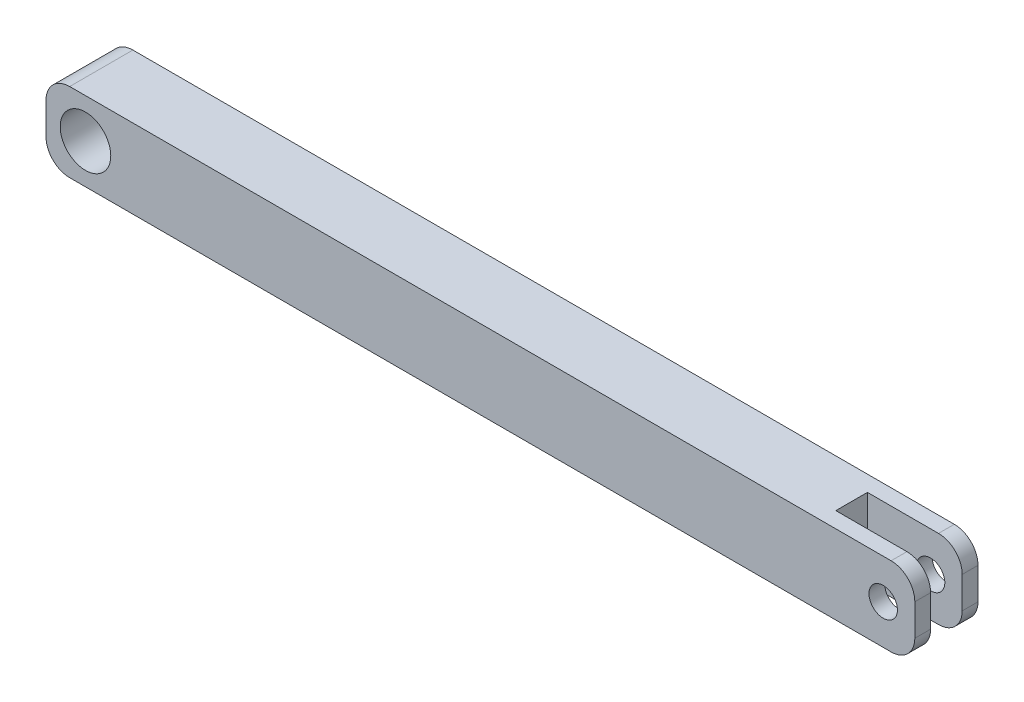
ISO-10303-21;
HEADER;
FILE_DESCRIPTION(('STEP AP214'),'2;1');
FILE_NAME('part.step','',(''),(''),'','','');
FILE_SCHEMA(('AUTOMOTIVE_DESIGN { 1 0 10303 214 1 1 1 1 }'));
ENDSEC;
DATA;
#1=APPLICATION_CONTEXT('core data for automotive mechanical design processes');
#2=APPLICATION_PROTOCOL_DEFINITION('international standard','automotive_design',2000,#1);
#3=PRODUCT_CONTEXT('',#1,'mechanical');
#4=PRODUCT('Part','Part','',(#3));
#5=PRODUCT_RELATED_PRODUCT_CATEGORY('part','',(#4));
#6=PRODUCT_DEFINITION_FORMATION('','',#4);
#7=PRODUCT_DEFINITION_CONTEXT('part definition',#1,'design');
#8=PRODUCT_DEFINITION('design','',#6,#7);
#9=PRODUCT_DEFINITION_SHAPE('','',#8);
#10=(LENGTH_UNIT() NAMED_UNIT(*) SI_UNIT(.MILLI.,.METRE.));
#11=(NAMED_UNIT(*) PLANE_ANGLE_UNIT() SI_UNIT($,.RADIAN.));
#12=(NAMED_UNIT(*) SI_UNIT($,.STERADIAN.) SOLID_ANGLE_UNIT());
#13=UNCERTAINTY_MEASURE_WITH_UNIT(LENGTH_MEASURE(1.E-05),#10,'distance_accuracy_value','');
#14=(GEOMETRIC_REPRESENTATION_CONTEXT(3) GLOBAL_UNCERTAINTY_ASSIGNED_CONTEXT((#13)) GLOBAL_UNIT_ASSIGNED_CONTEXT((#10,
#11,#12)) REPRESENTATION_CONTEXT('',''));
#15=CARTESIAN_POINT('',(0.,0.,0.));
#16=DIRECTION('',(0.,0.,1.));
#17=DIRECTION('',(1.,0.,0.));
#18=AXIS2_PLACEMENT_3D('',#15,#16,#17);
#19=CARTESIAN_POINT('',(55.,5.,3.));
#20=DIRECTION('',(-1.,0.,0.));
#21=DIRECTION('',(0.,0.,1.));
#22=AXIS2_PLACEMENT_3D('',#19,#20,#21);
#23=PLANE('',#22);
#24=DIRECTION('',(0.,0.,-1.));
#25=VECTOR('',#24,1.);
#26=CARTESIAN_POINT('',(55.,1.5,3.));
#27=LINE('',#26,#25);
#28=CARTESIAN_POINT('',(55.,1.5,3.5));
#29=VERTEX_POINT('',#28);
#30=CARTESIAN_POINT('',(55.,1.5,2.5));
#31=VERTEX_POINT('',#30);
#32=EDGE_CURVE('E254',#29,#31,#27,.T.);
#33=ORIENTED_EDGE('',*,*,#32,.T.);
#34=DIRECTION('',(0.,1.,0.));
#35=VECTOR('',#34,1.);
#36=CARTESIAN_POINT('',(55.,5.,2.5));
#37=LINE('',#36,#35);
#38=CARTESIAN_POINT('',(55.,3.5,2.5));
#39=VERTEX_POINT('',#38);
#40=EDGE_CURVE('E185',#31,#39,#37,.T.);
#41=ORIENTED_EDGE('',*,*,#40,.T.);
#42=DIRECTION('',(0.,0.,-1.));
#43=VECTOR('',#42,1.);
#44=CARTESIAN_POINT('',(55.,3.5,3.));
#45=LINE('',#44,#43);
#46=CARTESIAN_POINT('',(55.,3.5,3.5));
#47=VERTEX_POINT('',#46);
#48=EDGE_CURVE('E257',#39,#47,#45,.F.);
#49=ORIENTED_EDGE('',*,*,#48,.T.);
#50=DIRECTION('',(0.,1.,0.));
#51=VECTOR('',#50,1.);
#52=CARTESIAN_POINT('',(55.,1.5,3.5));
#53=LINE('',#52,#51);
#54=EDGE_CURVE('E232',#29,#47,#53,.T.);
#55=ORIENTED_EDGE('',*,*,#54,.F.);
#56=EDGE_LOOP('',(#33,#41,#49,#55));
#57=FACE_BOUND('',#56,.T.);
#58=ADVANCED_FACE('F41',(#57),#23,.F.);
#59=CARTESIAN_POINT('',(53.,2.5,3.001));
#60=DIRECTION('',(0.,0.,-1.));
#61=DIRECTION('',(-1.,0.,0.));
#62=AXIS2_PLACEMENT_3D('',#59,#60,#61);
#63=CYLINDRICAL_SURFACE('',#62,0.900000000000004);
#64=CARTESIAN_POINT('',(53.,2.5,2.5));
#65=DIRECTION('',(0.,0.,1.));
#66=DIRECTION('',(1.,0.,0.));
#67=AXIS2_PLACEMENT_3D('',#64,#65,#66);
#68=CIRCLE('',#67,0.900000000000004);
#69=CARTESIAN_POINT('',(53.9,2.5,2.5));
#70=VERTEX_POINT('',#69);
#71=EDGE_CURVE('E190',#70,#70,#68,.T.);
#72=ORIENTED_EDGE('',*,*,#71,.F.);
#73=EDGE_LOOP('',(#72));
#74=FACE_BOUND('',#73,.T.);
#75=CARTESIAN_POINT('',(53.,2.5,3.5));
#76=DIRECTION('',(0.,0.,1.));
#77=DIRECTION('',(1.,0.,0.));
#78=AXIS2_PLACEMENT_3D('',#75,#76,#77);
#79=CIRCLE('',#78,0.900000000000004);
#80=CARTESIAN_POINT('',(53.9,2.5,3.5));
#81=VERTEX_POINT('',#80);
#82=EDGE_CURVE('E223',#81,#81,#79,.T.);
#83=ORIENTED_EDGE('',*,*,#82,.T.);
#84=EDGE_LOOP('',(#83));
#85=FACE_BOUND('',#84,.T.);
#86=ADVANCED_FACE('F320',(#74,#85),#63,.F.);
#87=CARTESIAN_POINT('',(53.5,3.5,0.));
#88=DIRECTION('',(0.,0.,1.));
#89=DIRECTION('',(1.,0.,0.));
#90=AXIS2_PLACEMENT_3D('',#87,#88,#89);
#91=CYLINDRICAL_SURFACE('',#90,1.5);
#92=CARTESIAN_POINT('',(53.5,3.5,2.5));
#93=DIRECTION('',(0.,0.,1.));
#94=DIRECTION('',(1.,0.,0.));
#95=AXIS2_PLACEMENT_3D('',#92,#93,#94);
#96=CIRCLE('',#95,1.5);
#97=CARTESIAN_POINT('',(53.5,5.,2.5));
#98=VERTEX_POINT('',#97);
#99=EDGE_CURVE('E188',#98,#39,#96,.F.);
#100=ORIENTED_EDGE('',*,*,#99,.F.);
#101=DIRECTION('',(0.,0.,-1.));
#102=VECTOR('',#101,1.);
#103=CARTESIAN_POINT('',(53.5,5.,0.));
#104=LINE('',#103,#102);
#105=CARTESIAN_POINT('',(53.5,5.,3.5));
#106=VERTEX_POINT('',#105);
#107=EDGE_CURVE('E167',#106,#98,#104,.T.);
#108=ORIENTED_EDGE('',*,*,#107,.F.);
#109=CARTESIAN_POINT('',(53.5,3.5,3.5));
#110=DIRECTION('',(0.,0.,1.));
#111=DIRECTION('',(1.,0.,0.));
#112=AXIS2_PLACEMENT_3D('',#109,#110,#111);
#113=CIRCLE('',#112,1.5);
#114=EDGE_CURVE('E235',#47,#106,#113,.T.);
#115=ORIENTED_EDGE('',*,*,#114,.F.);
#116=ORIENTED_EDGE('',*,*,#48,.F.);
#117=EDGE_LOOP('',(#100,#108,#115,#116));
#118=FACE_BOUND('',#117,.T.);
#119=ADVANCED_FACE('F298',(#118),#91,.T.);
#120=CARTESIAN_POINT('',(53.5,1.5,3.));
#121=DIRECTION('',(0.,0.,-1.));
#122=DIRECTION('',(-1.,0.,0.));
#123=AXIS2_PLACEMENT_3D('',#120,#121,#122);
#124=CYLINDRICAL_SURFACE('',#123,1.5);
#125=CARTESIAN_POINT('',(53.5,1.5,2.5));
#126=DIRECTION('',(0.,0.,1.));
#127=DIRECTION('',(1.,0.,0.));
#128=AXIS2_PLACEMENT_3D('',#125,#126,#127);
#129=CIRCLE('',#128,1.5);
#130=CARTESIAN_POINT('',(53.5,0.,2.5));
#131=VERTEX_POINT('',#130);
#132=EDGE_CURVE('E183',#31,#131,#129,.F.);
#133=ORIENTED_EDGE('',*,*,#132,.F.);
#134=ORIENTED_EDGE('',*,*,#32,.F.);
#135=CARTESIAN_POINT('',(53.5,1.5,3.5));
#136=DIRECTION('',(0.,0.,1.));
#137=DIRECTION('',(1.,0.,0.));
#138=AXIS2_PLACEMENT_3D('',#135,#136,#137);
#139=CIRCLE('',#138,1.5);
#140=CARTESIAN_POINT('',(53.5,0.,3.5));
#141=VERTEX_POINT('',#140);
#142=EDGE_CURVE('E229',#141,#29,#139,.T.);
#143=ORIENTED_EDGE('',*,*,#142,.F.);
#144=DIRECTION('',(0.,0.,-1.));
#145=VECTOR('',#144,1.);
#146=CARTESIAN_POINT('',(53.5,0.,0.));
#147=LINE('',#146,#145);
#148=EDGE_CURVE('E55',#131,#141,#147,.F.);
#149=ORIENTED_EDGE('',*,*,#148,.F.);
#150=EDGE_LOOP('',(#133,#134,#143,#149));
#151=FACE_BOUND('',#150,.T.);
#152=ADVANCED_FACE('F292',(#151),#124,.T.);
#153=CARTESIAN_POINT('',(0.,5.,0.));
#154=DIRECTION('',(1.,0.,0.));
#155=DIRECTION('',(0.,0.,-1.));
#156=AXIS2_PLACEMENT_3D('',#153,#154,#155);
#157=PLANE('',#156);
#158=DIRECTION('',(0.,0.,1.));
#159=VECTOR('',#158,1.);
#160=CARTESIAN_POINT('',(0.,3.5,0.));
#161=LINE('',#160,#159);
#162=CARTESIAN_POINT('',(0.,3.5,3.5));
#163=VERTEX_POINT('',#162);
#164=CARTESIAN_POINT('',(0.,3.5,-0.5));
#165=VERTEX_POINT('',#164);
#166=EDGE_CURVE('E265',#163,#165,#161,.F.);
#167=ORIENTED_EDGE('',*,*,#166,.T.);
#168=DIRECTION('',(0.,1.,0.));
#169=VECTOR('',#168,1.);
#170=CARTESIAN_POINT('',(0.,1.5,-0.5));
#171=LINE('',#170,#169);
#172=CARTESIAN_POINT('',(0.,1.5,-0.5));
#173=VERTEX_POINT('',#172);
#174=EDGE_CURVE('E220',#173,#165,#171,.T.);
#175=ORIENTED_EDGE('',*,*,#174,.F.);
#176=DIRECTION('',(0.,0.,1.));
#177=VECTOR('',#176,1.);
#178=CARTESIAN_POINT('',(0.,1.5,0.));
#179=LINE('',#178,#177);
#180=CARTESIAN_POINT('',(0.,1.5,3.5));
#181=VERTEX_POINT('',#180);
#182=EDGE_CURVE('E267',#173,#181,#179,.T.);
#183=ORIENTED_EDGE('',*,*,#182,.T.);
#184=DIRECTION('',(0.,-1.,0.));
#185=VECTOR('',#184,1.);
#186=CARTESIAN_POINT('',(0.,3.5,3.5));
#187=LINE('',#186,#185);
#188=EDGE_CURVE('E244',#163,#181,#187,.T.);
#189=ORIENTED_EDGE('',*,*,#188,.F.);
#190=EDGE_LOOP('',(#167,#175,#183,#189));
#191=FACE_BOUND('',#190,.T.);
#192=ADVANCED_FACE('F310',(#191),#157,.F.);
#193=CARTESIAN_POINT('',(55.,3.5,-0.500000000000004));
#194=VERTEX_POINT('',#193);
#195=CARTESIAN_POINT('',(55.,3.5,0.5));
#196=VERTEX_POINT('',#195);
#197=EDGE_CURVE('E258',#194,#196,#45,.F.);
#198=ORIENTED_EDGE('',*,*,#197,.T.);
#199=DIRECTION('',(0.,-1.,0.));
#200=VECTOR('',#199,1.);
#201=CARTESIAN_POINT('',(55.,5.,0.5));
#202=LINE('',#201,#200);
#203=CARTESIAN_POINT('',(55.,1.5,0.5));
#204=VERTEX_POINT('',#203);
#205=EDGE_CURVE('E175',#196,#204,#202,.T.);
#206=ORIENTED_EDGE('',*,*,#205,.T.);
#207=CARTESIAN_POINT('',(55.,1.5,-0.500000000000004));
#208=VERTEX_POINT('',#207);
#209=EDGE_CURVE('E253',#204,#208,#27,.T.);
#210=ORIENTED_EDGE('',*,*,#209,.T.);
#211=DIRECTION('',(0.,-1.,0.));
#212=VECTOR('',#211,1.);
#213=CARTESIAN_POINT('',(55.,3.5,-0.500000000000004));
#214=LINE('',#213,#212);
#215=EDGE_CURVE('E208',#194,#208,#214,.T.);
#216=ORIENTED_EDGE('',*,*,#215,.F.);
#217=EDGE_LOOP('',(#198,#206,#210,#216));
#218=FACE_BOUND('',#217,.T.);
#219=ADVANCED_FACE('F277',(#218),#23,.F.);
#220=CARTESIAN_POINT('',(0.,5.,0.));
#221=DIRECTION('',(0.,1.,0.));
#222=DIRECTION('',(0.,0.,1.));
#223=AXIS2_PLACEMENT_3D('',#220,#221,#222);
#224=PLANE('',#223);
#225=DIRECTION('',(0.,0.,1.));
#226=VECTOR('',#225,1.);
#227=CARTESIAN_POINT('',(49.,5.,0.700000000000001));
#228=LINE('',#227,#226);
#229=CARTESIAN_POINT('',(49.,5.,0.500000000000001));
#230=VERTEX_POINT('',#229);
#231=CARTESIAN_POINT('',(49.,5.,2.5));
#232=VERTEX_POINT('',#231);
#233=EDGE_CURVE('E144',#230,#232,#228,.T.);
#234=ORIENTED_EDGE('',*,*,#233,.F.);
#235=DIRECTION('',(-1.,0.,0.));
#236=VECTOR('',#235,1.);
#237=CARTESIAN_POINT('',(55.1416152494944,5.,0.5));
#238=LINE('',#237,#236);
#239=CARTESIAN_POINT('',(53.5,5.,0.500000000000001));
#240=VERTEX_POINT('',#239);
#241=EDGE_CURVE('E162',#240,#230,#238,.T.);
#242=ORIENTED_EDGE('',*,*,#241,.F.);
#243=CARTESIAN_POINT('',(53.5,5.,-0.500000000000004));
#244=VERTEX_POINT('',#243);
#245=EDGE_CURVE('E251',#240,#244,#104,.T.);
#246=ORIENTED_EDGE('',*,*,#245,.T.);
#247=DIRECTION('',(1.,0.,0.));
#248=VECTOR('',#247,1.);
#249=CARTESIAN_POINT('',(1.5,5.,-0.5));
#250=LINE('',#249,#248);
#251=CARTESIAN_POINT('',(1.5,5.,-0.5));
#252=VERTEX_POINT('',#251);
#253=EDGE_CURVE('E202',#252,#244,#250,.T.);
#254=ORIENTED_EDGE('',*,*,#253,.F.);
#255=DIRECTION('',(0.,0.,1.));
#256=VECTOR('',#255,1.);
#257=CARTESIAN_POINT('',(1.5,5.,3.));
#258=LINE('',#257,#256);
#259=CARTESIAN_POINT('',(1.5,5.,3.5));
#260=VERTEX_POINT('',#259);
#261=EDGE_CURVE('E154',#252,#260,#258,.T.);
#262=ORIENTED_EDGE('',*,*,#261,.T.);
#263=DIRECTION('',(-1.,0.,0.));
#264=VECTOR('',#263,1.);
#265=CARTESIAN_POINT('',(53.5,5.,3.5));
#266=LINE('',#265,#264);
#267=EDGE_CURVE('E238',#106,#260,#266,.T.);
#268=ORIENTED_EDGE('',*,*,#267,.F.);
#269=ORIENTED_EDGE('',*,*,#107,.T.);
#270=DIRECTION('',(1.,0.,0.));
#271=VECTOR('',#270,1.);
#272=CARTESIAN_POINT('',(55.1416152494944,5.,2.5));
#273=LINE('',#272,#271);
#274=EDGE_CURVE('E160',#232,#98,#273,.T.);
#275=ORIENTED_EDGE('',*,*,#274,.F.);
#276=EDGE_LOOP('',(#234,#242,#246,#254,#262,#268,#269,#275));
#277=FACE_BOUND('',#276,.T.);
#278=ADVANCED_FACE('F165',(#277),#224,.T.);
#279=CARTESIAN_POINT('',(0.,0.,0.));
#280=DIRECTION('',(0.,1.,0.));
#281=DIRECTION('',(0.,0.,1.));
#282=AXIS2_PLACEMENT_3D('',#279,#280,#281);
#283=PLANE('',#282);
#284=DIRECTION('',(-1.,0.,0.));
#285=VECTOR('',#284,1.);
#286=CARTESIAN_POINT('',(0.,0.,0.500000000000006));
#287=LINE('',#286,#285);
#288=CARTESIAN_POINT('',(53.5,0.,0.5));
#289=VERTEX_POINT('',#288);
#290=CARTESIAN_POINT('',(49.,0.,0.500000000000001));
#291=VERTEX_POINT('',#290);
#292=EDGE_CURVE('E171',#289,#291,#287,.T.);
#293=ORIENTED_EDGE('',*,*,#292,.T.);
#294=DIRECTION('',(0.,0.,1.));
#295=VECTOR('',#294,1.);
#296=CARTESIAN_POINT('',(49.,0.,0.));
#297=LINE('',#296,#295);
#298=CARTESIAN_POINT('',(49.,0.,2.5));
#299=VERTEX_POINT('',#298);
#300=EDGE_CURVE('E269',#291,#299,#297,.T.);
#301=ORIENTED_EDGE('',*,*,#300,.T.);
#302=DIRECTION('',(1.,0.,0.));
#303=VECTOR('',#302,1.);
#304=CARTESIAN_POINT('',(0.,0.,2.50000000000001));
#305=LINE('',#304,#303);
#306=EDGE_CURVE('E11',#299,#131,#305,.T.);
#307=ORIENTED_EDGE('',*,*,#306,.T.);
#308=ORIENTED_EDGE('',*,*,#148,.T.);
#309=DIRECTION('',(1.,0.,0.));
#310=VECTOR('',#309,1.);
#311=CARTESIAN_POINT('',(1.5,0.,3.5));
#312=LINE('',#311,#310);
#313=CARTESIAN_POINT('',(1.5,0.,3.5));
#314=VERTEX_POINT('',#313);
#315=EDGE_CURVE('E155',#314,#141,#312,.T.);
#316=ORIENTED_EDGE('',*,*,#315,.F.);
#317=DIRECTION('',(0.,0.,1.));
#318=VECTOR('',#317,1.);
#319=CARTESIAN_POINT('',(1.5,0.,0.));
#320=LINE('',#319,#318);
#321=CARTESIAN_POINT('',(1.5,0.,-0.5));
#322=VERTEX_POINT('',#321);
#323=EDGE_CURVE('E63',#314,#322,#320,.F.);
#324=ORIENTED_EDGE('',*,*,#323,.T.);
#325=DIRECTION('',(-1.,0.,0.));
#326=VECTOR('',#325,1.);
#327=CARTESIAN_POINT('',(53.5,0.,-0.500000000000004));
#328=LINE('',#327,#326);
#329=CARTESIAN_POINT('',(53.5,0.,-0.500000000000004));
#330=VERTEX_POINT('',#329);
#331=EDGE_CURVE('E214',#330,#322,#328,.T.);
#332=ORIENTED_EDGE('',*,*,#331,.F.);
#333=EDGE_CURVE('E262',#330,#289,#147,.F.);
#334=ORIENTED_EDGE('',*,*,#333,.T.);
#335=EDGE_LOOP('',(#293,#301,#307,#308,#316,#324,#332,#334));
#336=FACE_BOUND('',#335,.T.);
#337=ADVANCED_FACE('F285',(#336),#283,.F.);
#338=CARTESIAN_POINT('',(2.5,2.5,-0.00100000000000013));
#339=DIRECTION('',(0.,0.,1.));
#340=DIRECTION('',(1.,0.,0.));
#341=AXIS2_PLACEMENT_3D('',#338,#339,#340);
#342=CYLINDRICAL_SURFACE('',#341,1.6);
#343=CARTESIAN_POINT('',(2.5,2.5,3.5));
#344=DIRECTION('',(0.,0.,1.));
#345=DIRECTION('',(1.,0.,0.));
#346=AXIS2_PLACEMENT_3D('',#343,#344,#345);
#347=CIRCLE('',#346,1.6);
#348=CARTESIAN_POINT('',(4.1,2.5,3.5));
#349=VERTEX_POINT('',#348);
#350=EDGE_CURVE('E226',#349,#349,#347,.T.);
#351=CARTESIAN_POINT('',(2.5,2.5,-0.5));
#352=DIRECTION('',(0.,0.,-1.));
#353=DIRECTION('',(-1.,0.,0.));
#354=AXIS2_PLACEMENT_3D('',#351,#352,#353);
#355=CIRCLE('',#354,1.6);
#356=CARTESIAN_POINT('',(4.1,2.5,-0.5));
#357=VERTEX_POINT('',#356);
#358=EDGE_CURVE('E193',#357,#357,#355,.T.);
#359=CARTESIAN_POINT('',(4.1,2.5,3.5));
#360=CARTESIAN_POINT('',(4.1,2.5,3.45833333333333));
#361=CARTESIAN_POINT('',(4.1,2.5,3.41666666666667));
#362=CARTESIAN_POINT('',(4.1,2.5,3.33333333333333));
#363=CARTESIAN_POINT('',(4.1,2.5,3.29166666666667));
#364=CARTESIAN_POINT('',(4.1,2.5,3.20833333333333));
#365=CARTESIAN_POINT('',(4.1,2.5,3.16666666666667));
#366=CARTESIAN_POINT('',(4.1,2.5,3.08333333333333));
#367=CARTESIAN_POINT('',(4.1,2.5,3.04166666666667));
#368=CARTESIAN_POINT('',(4.1,2.5,2.95833333333333));
#369=CARTESIAN_POINT('',(4.1,2.5,2.91666666666667));
#370=CARTESIAN_POINT('',(4.1,2.5,2.83333333333333));
#371=CARTESIAN_POINT('',(4.1,2.5,2.79166666666667));
#372=CARTESIAN_POINT('',(4.1,2.5,2.70833333333333));
#373=CARTESIAN_POINT('',(4.1,2.5,2.66666666666667));
#374=CARTESIAN_POINT('',(4.1,2.5,2.58333333333333));
#375=CARTESIAN_POINT('',(4.1,2.5,2.54166666666667));
#376=CARTESIAN_POINT('',(4.1,2.5,2.45833333333333));
#377=CARTESIAN_POINT('',(4.1,2.5,2.41666666666667));
#378=CARTESIAN_POINT('',(4.1,2.5,2.33333333333333));
#379=CARTESIAN_POINT('',(4.1,2.5,2.29166666666667));
#380=CARTESIAN_POINT('',(4.1,2.5,2.20833333333333));
#381=CARTESIAN_POINT('',(4.1,2.5,2.16666666666667));
#382=CARTESIAN_POINT('',(4.1,2.5,2.08333333333333));
#383=CARTESIAN_POINT('',(4.1,2.5,2.04166666666667));
#384=CARTESIAN_POINT('',(4.1,2.5,1.95833333333333));
#385=CARTESIAN_POINT('',(4.1,2.5,1.91666666666667));
#386=CARTESIAN_POINT('',(4.1,2.5,1.83333333333333));
#387=CARTESIAN_POINT('',(4.1,2.5,1.79166666666667));
#388=CARTESIAN_POINT('',(4.1,2.5,1.70833333333333));
#389=CARTESIAN_POINT('',(4.1,2.5,1.66666666666667));
#390=CARTESIAN_POINT('',(4.1,2.5,1.58333333333333));
#391=CARTESIAN_POINT('',(4.1,2.5,1.54166666666667));
#392=CARTESIAN_POINT('',(4.1,2.5,1.45833333333333));
#393=CARTESIAN_POINT('',(4.1,2.5,1.41666666666667));
#394=CARTESIAN_POINT('',(4.1,2.5,1.33333333333333));
#395=CARTESIAN_POINT('',(4.1,2.5,1.29166666666667));
#396=CARTESIAN_POINT('',(4.1,2.5,1.20833333333333));
#397=CARTESIAN_POINT('',(4.1,2.5,1.16666666666667));
#398=CARTESIAN_POINT('',(4.1,2.5,1.08333333333333));
#399=CARTESIAN_POINT('',(4.1,2.5,1.04166666666667));
#400=CARTESIAN_POINT('',(4.1,2.5,0.958333333333333));
#401=CARTESIAN_POINT('',(4.1,2.5,0.916666666666666));
#402=CARTESIAN_POINT('',(4.1,2.5,0.833333333333333));
#403=CARTESIAN_POINT('',(4.1,2.5,0.791666666666666));
#404=CARTESIAN_POINT('',(4.1,2.5,0.708333333333333));
#405=CARTESIAN_POINT('',(4.1,2.5,0.666666666666666));
#406=CARTESIAN_POINT('',(4.1,2.5,0.583333333333333));
#407=CARTESIAN_POINT('',(4.1,2.5,0.541666666666666));
#408=CARTESIAN_POINT('',(4.1,2.5,0.458333333333333));
#409=CARTESIAN_POINT('',(4.1,2.5,0.416666666666666));
#410=CARTESIAN_POINT('',(4.1,2.5,0.333333333333333));
#411=CARTESIAN_POINT('',(4.1,2.5,0.291666666666666));
#412=CARTESIAN_POINT('',(4.1,2.5,0.208333333333333));
#413=CARTESIAN_POINT('',(4.1,2.5,0.166666666666666));
#414=CARTESIAN_POINT('',(4.1,2.5,0.083333333333333));
#415=CARTESIAN_POINT('',(4.1,2.5,0.0416666666666663));
#416=CARTESIAN_POINT('',(4.1,2.5,-0.0416666666666671));
#417=CARTESIAN_POINT('',(4.1,2.5,-0.0833333333333338));
#418=CARTESIAN_POINT('',(4.1,2.5,-0.166666666666667));
#419=CARTESIAN_POINT('',(4.1,2.5,-0.208333333333334));
#420=CARTESIAN_POINT('',(4.1,2.5,-0.291666666666667));
#421=CARTESIAN_POINT('',(4.1,2.5,-0.333333333333334));
#422=CARTESIAN_POINT('',(4.1,2.5,-0.416666666666667));
#423=CARTESIAN_POINT('',(4.1,2.5,-0.458333333333334));
#424=CARTESIAN_POINT('',(4.1,2.5,-0.5));
#425=B_SPLINE_CURVE_WITH_KNOTS('',3,(#359,#360,#361,#362,#363,#364,#365,#366,#367,#368,#369,
#370,#371,#372,#373,#374,#375,#376,#377,#378,#379,#380,#381,#382,#383,#384,#385,#386,#387,#388,
#389,#390,#391,#392,#393,#394,#395,#396,#397,#398,#399,#400,#401,#402,#403,#404,#405,#406,#407,
#408,#409,#410,#411,#412,#413,#414,#415,#416,#417,#418,#419,#420,#421,#422,#423,#424),
.UNSPECIFIED.,.F.,.F.,(4,2,2,2,2,2,2,2,2,2,2,2,2,2,2,2,2,2,2,2,2,2,2,2,2,2,2,2,2,2,2,2,4),(0.,
0.125,0.25,0.375,0.5,0.625,0.75,0.875,1.,1.125,1.25,1.375,1.5,1.625,1.75,1.875,2.,2.125,2.25,
2.375,2.5,2.625,2.75,2.875,3.,3.125,3.25,3.375,3.5,3.625,3.75,3.875,4.),.UNSPECIFIED.);
#426=EDGE_CURVE('BSEAM346',#349,#357,#425,.T.);
#427=ORIENTED_EDGE('',*,*,#350,.T.);
#428=ORIENTED_EDGE('',*,*,#358,.T.);
#429=ORIENTED_EDGE('',*,*,#426,.T.);
#430=ORIENTED_EDGE('',*,*,#426,.F.);
#431=EDGE_LOOP('',(#427,#429,#428,#430));
#432=FACE_BOUND('',#431,.T.);
#433=ADVANCED_FACE('F346',(#432),#342,.F.);
#434=CARTESIAN_POINT('',(53.,2.5,0.500000000000001));
#435=DIRECTION('',(0.,0.,-1.));
#436=DIRECTION('',(-1.,0.,0.));
#437=AXIS2_PLACEMENT_3D('',#434,#435,#436);
#438=CIRCLE('',#437,0.900000000000004);
#439=CARTESIAN_POINT('',(52.1,2.5,0.500000000000001));
#440=VERTEX_POINT('',#439);
#441=EDGE_CURVE('E180',#440,#440,#438,.T.);
#442=ORIENTED_EDGE('',*,*,#441,.F.);
#443=EDGE_LOOP('',(#442));
#444=FACE_BOUND('',#443,.T.);
#445=CARTESIAN_POINT('',(53.,2.5,-0.500000000000004));
#446=DIRECTION('',(0.,0.,-1.));
#447=DIRECTION('',(-1.,0.,0.));
#448=AXIS2_PLACEMENT_3D('',#445,#446,#447);
#449=CIRCLE('',#448,0.900000000000004);
#450=CARTESIAN_POINT('',(52.1,2.5,-0.500000000000004));
#451=VERTEX_POINT('',#450);
#452=EDGE_CURVE('E196',#451,#451,#449,.T.);
#453=ORIENTED_EDGE('',*,*,#452,.T.);
#454=EDGE_LOOP('',(#453));
#455=FACE_BOUND('',#454,.T.);
#456=ADVANCED_FACE('F328',(#444,#455),#63,.F.);
#457=CARTESIAN_POINT('',(53.5,3.5,0.500000000000001));
#458=DIRECTION('',(0.,0.,-1.));
#459=DIRECTION('',(-1.,0.,0.));
#460=AXIS2_PLACEMENT_3D('',#457,#458,#459);
#461=CIRCLE('',#460,1.5);
#462=EDGE_CURVE('E178',#196,#240,#461,.F.);
#463=ORIENTED_EDGE('',*,*,#462,.F.);
#464=ORIENTED_EDGE('',*,*,#197,.F.);
#465=CARTESIAN_POINT('',(53.5,3.5,-0.500000000000004));
#466=DIRECTION('',(0.,0.,-1.));
#467=DIRECTION('',(-1.,0.,0.));
#468=AXIS2_PLACEMENT_3D('',#465,#466,#467);
#469=CIRCLE('',#468,1.5);
#470=EDGE_CURVE('E205',#244,#194,#469,.T.);
#471=ORIENTED_EDGE('',*,*,#470,.F.);
#472=ORIENTED_EDGE('',*,*,#245,.F.);
#473=EDGE_LOOP('',(#463,#464,#471,#472));
#474=FACE_BOUND('',#473,.T.);
#475=ADVANCED_FACE('F303',(#474),#91,.T.);
#476=CARTESIAN_POINT('',(53.5,1.5,0.5));
#477=DIRECTION('',(0.,0.,-1.));
#478=DIRECTION('',(-1.,0.,0.));
#479=AXIS2_PLACEMENT_3D('',#476,#477,#478);
#480=CIRCLE('',#479,1.5);
#481=EDGE_CURVE('E49',#289,#204,#480,.F.);
#482=ORIENTED_EDGE('',*,*,#481,.F.);
#483=ORIENTED_EDGE('',*,*,#333,.F.);
#484=CARTESIAN_POINT('',(53.5,1.5,-0.500000000000004));
#485=DIRECTION('',(0.,0.,-1.));
#486=DIRECTION('',(-1.,0.,0.));
#487=AXIS2_PLACEMENT_3D('',#484,#485,#486);
#488=CIRCLE('',#487,1.5);
#489=EDGE_CURVE('E211',#208,#330,#488,.T.);
#490=ORIENTED_EDGE('',*,*,#489,.F.);
#491=ORIENTED_EDGE('',*,*,#209,.F.);
#492=EDGE_LOOP('',(#482,#483,#490,#491));
#493=FACE_BOUND('',#492,.T.);
#494=ADVANCED_FACE('F280',(#493),#124,.T.);
#495=CARTESIAN_POINT('',(1.5,1.5,0.));
#496=DIRECTION('',(0.,0.,1.));
#497=DIRECTION('',(1.,0.,0.));
#498=AXIS2_PLACEMENT_3D('',#495,#496,#497);
#499=CYLINDRICAL_SURFACE('',#498,1.5);
#500=ORIENTED_EDGE('',*,*,#182,.F.);
#501=CARTESIAN_POINT('',(1.5,1.5,-0.5));
#502=DIRECTION('',(0.,0.,-1.));
#503=DIRECTION('',(-1.,0.,0.));
#504=AXIS2_PLACEMENT_3D('',#501,#502,#503);
#505=CIRCLE('',#504,1.5);
#506=EDGE_CURVE('E217',#322,#173,#505,.T.);
#507=ORIENTED_EDGE('',*,*,#506,.F.);
#508=ORIENTED_EDGE('',*,*,#323,.F.);
#509=CARTESIAN_POINT('',(1.5,1.5,3.5));
#510=DIRECTION('',(0.,0.,1.));
#511=DIRECTION('',(1.,0.,0.));
#512=AXIS2_PLACEMENT_3D('',#509,#510,#511);
#513=CIRCLE('',#512,1.5);
#514=EDGE_CURVE('E247',#181,#314,#513,.T.);
#515=ORIENTED_EDGE('',*,*,#514,.F.);
#516=EDGE_LOOP('',(#500,#507,#508,#515));
#517=FACE_BOUND('',#516,.T.);
#518=ADVANCED_FACE('F311',(#517),#499,.T.);
#519=CARTESIAN_POINT('',(1.5,3.5,0.));
#520=DIRECTION('',(0.,0.,-1.));
#521=DIRECTION('',(-1.,0.,0.));
#522=AXIS2_PLACEMENT_3D('',#519,#520,#521);
#523=CYLINDRICAL_SURFACE('',#522,1.5);
#524=ORIENTED_EDGE('',*,*,#261,.F.);
#525=CARTESIAN_POINT('',(1.5,3.5,-0.5));
#526=DIRECTION('',(0.,0.,-1.));
#527=DIRECTION('',(-1.,0.,0.));
#528=AXIS2_PLACEMENT_3D('',#525,#526,#527);
#529=CIRCLE('',#528,1.5);
#530=EDGE_CURVE('E199',#165,#252,#529,.T.);
#531=ORIENTED_EDGE('',*,*,#530,.F.);
#532=ORIENTED_EDGE('',*,*,#166,.F.);
#533=CARTESIAN_POINT('',(1.5,3.5,3.5));
#534=DIRECTION('',(0.,0.,1.));
#535=DIRECTION('',(1.,0.,0.));
#536=AXIS2_PLACEMENT_3D('',#533,#534,#535);
#537=CIRCLE('',#536,1.5);
#538=EDGE_CURVE('E241',#260,#163,#537,.T.);
#539=ORIENTED_EDGE('',*,*,#538,.F.);
#540=EDGE_LOOP('',(#524,#531,#532,#539));
#541=FACE_BOUND('',#540,.T.);
#542=ADVANCED_FACE('F43',(#541),#523,.T.);
#543=CARTESIAN_POINT('',(49.,-5.,0.700000000000001));
#544=DIRECTION('',(-1.,0.,0.));
#545=DIRECTION('',(0.,0.,1.));
#546=AXIS2_PLACEMENT_3D('',#543,#544,#545);
#547=PLANE('',#546);
#548=ORIENTED_EDGE('',*,*,#300,.F.);
#549=DIRECTION('',(0.,1.,0.));
#550=VECTOR('',#549,1.);
#551=CARTESIAN_POINT('',(49.,-5.,0.500000000000001));
#552=LINE('',#551,#550);
#553=EDGE_CURVE('E149',#291,#230,#552,.T.);
#554=ORIENTED_EDGE('',*,*,#553,.T.);
#555=ORIENTED_EDGE('',*,*,#233,.T.);
#556=DIRECTION('',(0.,1.,0.));
#557=VECTOR('',#556,1.);
#558=CARTESIAN_POINT('',(49.,-5.,2.5));
#559=LINE('',#558,#557);
#560=EDGE_CURVE('E147',#299,#232,#559,.T.);
#561=ORIENTED_EDGE('',*,*,#560,.F.);
#562=EDGE_LOOP('',(#548,#554,#555,#561));
#563=FACE_BOUND('',#562,.T.);
#564=ADVANCED_FACE('F146',(#563),#547,.F.);
#565=CARTESIAN_POINT('',(53.5,1.5,3.5));
#566=DIRECTION('',(0.,0.,1.));
#567=DIRECTION('',(1.,0.,0.));
#568=AXIS2_PLACEMENT_3D('',#565,#566,#567);
#569=PLANE('',#568);
#570=ORIENTED_EDGE('',*,*,#350,.F.);
#571=EDGE_LOOP('',(#570));
#572=FACE_BOUND('',#571,.T.);
#573=ORIENTED_EDGE('',*,*,#142,.T.);
#574=ORIENTED_EDGE('',*,*,#54,.T.);
#575=ORIENTED_EDGE('',*,*,#114,.T.);
#576=ORIENTED_EDGE('',*,*,#267,.T.);
#577=ORIENTED_EDGE('',*,*,#538,.T.);
#578=ORIENTED_EDGE('',*,*,#188,.T.);
#579=ORIENTED_EDGE('',*,*,#514,.T.);
#580=ORIENTED_EDGE('',*,*,#315,.T.);
#581=EDGE_LOOP('',(#573,#574,#575,#576,#577,#578,#579,#580));
#582=FACE_BOUND('',#581,.T.);
#583=ORIENTED_EDGE('',*,*,#82,.F.);
#584=EDGE_LOOP('',(#583));
#585=FACE_BOUND('',#584,.T.);
#586=ADVANCED_FACE('F288',(#572,#582,#585),#569,.T.);
#587=CARTESIAN_POINT('',(1.5,3.5,-0.5));
#588=DIRECTION('',(0.,0.,-1.));
#589=DIRECTION('',(-1.,0.,0.));
#590=AXIS2_PLACEMENT_3D('',#587,#588,#589);
#591=PLANE('',#590);
#592=ORIENTED_EDGE('',*,*,#452,.F.);
#593=EDGE_LOOP('',(#592));
#594=FACE_BOUND('',#593,.T.);
#595=ORIENTED_EDGE('',*,*,#530,.T.);
#596=ORIENTED_EDGE('',*,*,#253,.T.);
#597=ORIENTED_EDGE('',*,*,#470,.T.);
#598=ORIENTED_EDGE('',*,*,#215,.T.);
#599=ORIENTED_EDGE('',*,*,#489,.T.);
#600=ORIENTED_EDGE('',*,*,#331,.T.);
#601=ORIENTED_EDGE('',*,*,#506,.T.);
#602=ORIENTED_EDGE('',*,*,#174,.T.);
#603=EDGE_LOOP('',(#595,#596,#597,#598,#599,#600,#601,#602));
#604=FACE_BOUND('',#603,.T.);
#605=ORIENTED_EDGE('',*,*,#358,.F.);
#606=EDGE_LOOP('',(#605));
#607=FACE_BOUND('',#606,.T.);
#608=ADVANCED_FACE('F283',(#594,#604,#607),#591,.T.);
#609=CARTESIAN_POINT('',(55.1416152494944,-5.,0.5));
#610=DIRECTION('',(0.,0.,-1.));
#611=DIRECTION('',(-1.,0.,0.));
#612=AXIS2_PLACEMENT_3D('',#609,#610,#611);
#613=PLANE('',#612);
#614=ORIENTED_EDGE('',*,*,#441,.T.);
#615=EDGE_LOOP('',(#614));
#616=FACE_BOUND('',#615,.T.);
#617=ORIENTED_EDGE('',*,*,#462,.T.);
#618=ORIENTED_EDGE('',*,*,#241,.T.);
#619=ORIENTED_EDGE('',*,*,#553,.F.);
#620=ORIENTED_EDGE('',*,*,#292,.F.);
#621=ORIENTED_EDGE('',*,*,#481,.T.);
#622=ORIENTED_EDGE('',*,*,#205,.F.);
#623=EDGE_LOOP('',(#617,#618,#619,#620,#621,#622));
#624=FACE_BOUND('',#623,.T.);
#625=ADVANCED_FACE('F272',(#616,#624),#613,.F.);
#626=CARTESIAN_POINT('',(55.1416152494944,-5.,2.5));
#627=DIRECTION('',(0.,0.,1.));
#628=DIRECTION('',(1.,0.,0.));
#629=AXIS2_PLACEMENT_3D('',#626,#627,#628);
#630=PLANE('',#629);
#631=ORIENTED_EDGE('',*,*,#71,.T.);
#632=EDGE_LOOP('',(#631));
#633=FACE_BOUND('',#632,.T.);
#634=ORIENTED_EDGE('',*,*,#99,.T.);
#635=ORIENTED_EDGE('',*,*,#40,.F.);
#636=ORIENTED_EDGE('',*,*,#132,.T.);
#637=ORIENTED_EDGE('',*,*,#306,.F.);
#638=ORIENTED_EDGE('',*,*,#560,.T.);
#639=ORIENTED_EDGE('',*,*,#274,.T.);
#640=EDGE_LOOP('',(#634,#635,#636,#637,#638,#639));
#641=FACE_BOUND('',#640,.T.);
#642=ADVANCED_FACE('F159',(#633,#641),#630,.F.);
#643=CLOSED_SHELL('',(#58,#86,#119,#152,#192,#219,#278,#337,#433,#456,#475,#494,#518,#542,#564,
#586,#608,#625,#642));
#644=MANIFOLD_SOLID_BREP('B2',#643);
#645=ADVANCED_BREP_SHAPE_REPRESENTATION('',(#18,#644),#14);
#646=SHAPE_DEFINITION_REPRESENTATION(#9,#645);
ENDSEC;
END-ISO-10303-21;
